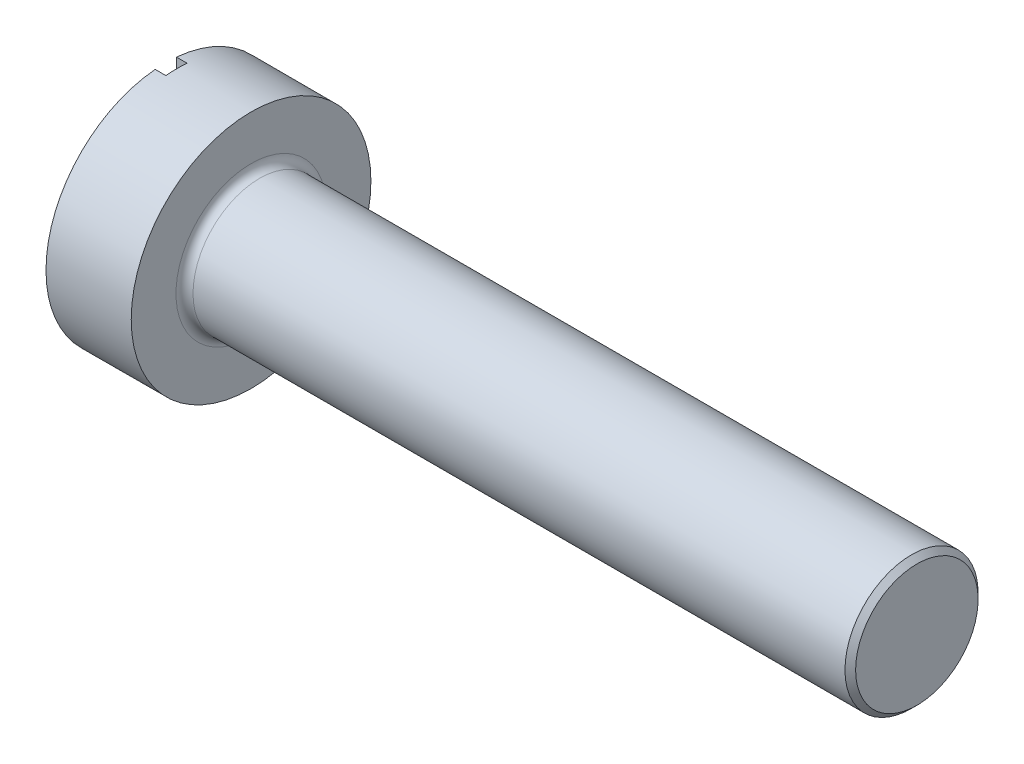
ISO-10303-21;
HEADER;
FILE_DESCRIPTION(('STEP AP214'),'2;1');
FILE_NAME('part.step','',(''),(''),'','','');
FILE_SCHEMA(('AUTOMOTIVE_DESIGN { 1 0 10303 214 1 1 1 1 }'));
ENDSEC;
DATA;
#1=APPLICATION_CONTEXT('core data for automotive mechanical design processes');
#2=APPLICATION_PROTOCOL_DEFINITION('international standard','automotive_design',2000,#1);
#3=PRODUCT_CONTEXT('',#1,'mechanical');
#4=PRODUCT('Part','Part','',(#3));
#5=PRODUCT_RELATED_PRODUCT_CATEGORY('part','',(#4));
#6=PRODUCT_DEFINITION_FORMATION('','',#4);
#7=PRODUCT_DEFINITION_CONTEXT('part definition',#1,'design');
#8=PRODUCT_DEFINITION('design','',#6,#7);
#9=PRODUCT_DEFINITION_SHAPE('','',#8);
#10=(LENGTH_UNIT() NAMED_UNIT(*) SI_UNIT(.MILLI.,.METRE.));
#11=(NAMED_UNIT(*) PLANE_ANGLE_UNIT() SI_UNIT($,.RADIAN.));
#12=(NAMED_UNIT(*) SI_UNIT($,.STERADIAN.) SOLID_ANGLE_UNIT());
#13=UNCERTAINTY_MEASURE_WITH_UNIT(LENGTH_MEASURE(1.E-05),#10,'distance_accuracy_value','');
#14=(GEOMETRIC_REPRESENTATION_CONTEXT(3) GLOBAL_UNCERTAINTY_ASSIGNED_CONTEXT((#13)) GLOBAL_UNIT_ASSIGNED_CONTEXT((#10,
#11,#12)) REPRESENTATION_CONTEXT('',''));
#15=CARTESIAN_POINT('',(0.,0.,0.));
#16=DIRECTION('',(0.,0.,1.));
#17=DIRECTION('',(1.,0.,0.));
#18=AXIS2_PLACEMENT_3D('',#15,#16,#17);
#19=CARTESIAN_POINT('',(0.,0.,0.));
#20=DIRECTION('',(-1.,0.,0.));
#21=DIRECTION('',(0.,0.,1.));
#22=AXIS2_PLACEMENT_3D('',#19,#20,#21);
#23=CYLINDRICAL_SURFACE('',#22,2.25);
#24=CARTESIAN_POINT('',(1.6,0.,0.));
#25=DIRECTION('',(-1.,0.,0.));
#26=DIRECTION('',(0.,0.,1.));
#27=AXIS2_PLACEMENT_3D('',#24,#25,#26);
#28=CIRCLE('',#27,2.25);
#29=CARTESIAN_POINT('',(1.6,0.,2.25));
#30=VERTEX_POINT('',#29);
#31=EDGE_CURVE('E92',#30,#30,#28,.T.);
#32=ORIENTED_EDGE('',*,*,#31,.T.);
#33=EDGE_LOOP('',(#32));
#34=FACE_BOUND('',#33,.T.);
#35=DIRECTION('',(-1.,0.,0.));
#36=VECTOR('',#35,1.);
#37=CARTESIAN_POINT('',(0.,-2.2410934831015,0.2));
#38=LINE('',#37,#36);
#39=CARTESIAN_POINT('',(0.2,-2.2410934831015,0.2));
#40=VERTEX_POINT('',#39);
#41=CARTESIAN_POINT('',(0.,-2.2410934831015,0.2));
#42=VERTEX_POINT('',#41);
#43=EDGE_CURVE('E122',#40,#42,#38,.T.);
#44=ORIENTED_EDGE('',*,*,#43,.F.);
#45=CARTESIAN_POINT('',(0.2,0.,0.));
#46=DIRECTION('',(-1.,0.,0.));
#47=DIRECTION('',(0.,0.,1.));
#48=AXIS2_PLACEMENT_3D('',#45,#46,#47);
#49=CIRCLE('',#48,2.25);
#50=CARTESIAN_POINT('',(0.2,-2.2410934831015,-0.2));
#51=VERTEX_POINT('',#50);
#52=EDGE_CURVE('E11',#40,#51,#49,.F.);
#53=ORIENTED_EDGE('',*,*,#52,.T.);
#54=DIRECTION('',(-1.,0.,0.));
#55=VECTOR('',#54,1.);
#56=CARTESIAN_POINT('',(0.,-2.2410934831015,-0.2));
#57=LINE('',#56,#55);
#58=CARTESIAN_POINT('',(0.,-2.2410934831015,-0.2));
#59=VERTEX_POINT('',#58);
#60=EDGE_CURVE('E79',#51,#59,#57,.T.);
#61=ORIENTED_EDGE('',*,*,#60,.T.);
#62=CARTESIAN_POINT('',(0.,0.,0.));
#63=DIRECTION('',(-1.,0.,0.));
#64=DIRECTION('',(0.,0.,1.));
#65=AXIS2_PLACEMENT_3D('',#62,#63,#64);
#66=CIRCLE('',#65,2.25);
#67=CARTESIAN_POINT('',(0.,2.2410934831015,-0.2));
#68=VERTEX_POINT('',#67);
#69=EDGE_CURVE('E88',#68,#59,#66,.T.);
#70=ORIENTED_EDGE('',*,*,#69,.F.);
#71=DIRECTION('',(-1.,0.,0.));
#72=VECTOR('',#71,1.);
#73=CARTESIAN_POINT('',(0.,2.2410934831015,-0.2));
#74=LINE('',#73,#72);
#75=CARTESIAN_POINT('',(0.2,2.2410934831015,-0.2));
#76=VERTEX_POINT('',#75);
#77=EDGE_CURVE('E52',#68,#76,#74,.F.);
#78=ORIENTED_EDGE('',*,*,#77,.T.);
#79=CARTESIAN_POINT('',(0.2,2.2410934831015,0.2));
#80=VERTEX_POINT('',#79);
#81=EDGE_CURVE('E41',#76,#80,#49,.F.);
#82=ORIENTED_EDGE('',*,*,#81,.T.);
#83=DIRECTION('',(-1.,0.,0.));
#84=VECTOR('',#83,1.);
#85=CARTESIAN_POINT('',(0.,2.2410934831015,0.2));
#86=LINE('',#85,#84);
#87=CARTESIAN_POINT('',(0.,2.2410934831015,0.2));
#88=VERTEX_POINT('',#87);
#89=EDGE_CURVE('E99',#88,#80,#86,.F.);
#90=ORIENTED_EDGE('',*,*,#89,.F.);
#91=EDGE_CURVE('E93',#42,#88,#66,.T.);
#92=ORIENTED_EDGE('',*,*,#91,.F.);
#93=EDGE_LOOP('',(#44,#53,#61,#70,#78,#82,#90,#92));
#94=FACE_BOUND('',#93,.T.);
#95=ADVANCED_FACE('F37',(#34,#94),#23,.T.);
#96=CARTESIAN_POINT('',(0.,0.,0.));
#97=DIRECTION('',(-1.,0.,0.));
#98=DIRECTION('',(0.,0.,1.));
#99=AXIS2_PLACEMENT_3D('',#96,#97,#98);
#100=PLANE('',#99);
#101=ORIENTED_EDGE('',*,*,#69,.T.);
#102=DIRECTION('',(0.,1.,0.));
#103=VECTOR('',#102,1.);
#104=CARTESIAN_POINT('',(0.,0.,-0.2));
#105=LINE('',#104,#103);
#106=EDGE_CURVE('E76',#59,#68,#105,.T.);
#107=ORIENTED_EDGE('',*,*,#106,.T.);
#108=EDGE_LOOP('',(#101,#107));
#109=FACE_BOUND('',#108,.T.);
#110=ADVANCED_FACE('F91',(#109),#100,.T.);
#111=CARTESIAN_POINT('',(14.1,0.,0.));
#112=DIRECTION('',(-1.,0.,0.));
#113=DIRECTION('',(0.,0.,1.));
#114=AXIS2_PLACEMENT_3D('',#111,#112,#113);
#115=PLANE('',#114);
#116=CARTESIAN_POINT('',(14.1,0.,0.));
#117=DIRECTION('',(-1.,0.,0.));
#118=DIRECTION('',(0.,0.,1.));
#119=AXIS2_PLACEMENT_3D('',#116,#117,#118);
#120=CIRCLE('',#119,1.15);
#121=CARTESIAN_POINT('',(14.1,0.,1.15));
#122=VERTEX_POINT('',#121);
#123=EDGE_CURVE('E105',#122,#122,#120,.F.);
#124=ORIENTED_EDGE('',*,*,#123,.T.);
#125=EDGE_LOOP('',(#124));
#126=FACE_BOUND('',#125,.T.);
#127=ADVANCED_FACE('F141',(#126),#115,.F.);
#128=CARTESIAN_POINT('',(0.,0.,0.));
#129=DIRECTION('',(-1.,0.,0.));
#130=DIRECTION('',(0.,0.,1.));
#131=AXIS2_PLACEMENT_3D('',#128,#129,#130);
#132=CYLINDRICAL_SURFACE('',#131,1.25);
#133=CARTESIAN_POINT('',(1.76,0.,0.));
#134=DIRECTION('',(1.,0.,0.));
#135=DIRECTION('',(0.,0.,-1.));
#136=AXIS2_PLACEMENT_3D('',#133,#134,#135);
#137=CIRCLE('',#136,1.25);
#138=CARTESIAN_POINT('',(1.76,0.,-1.25));
#139=VERTEX_POINT('',#138);
#140=EDGE_CURVE('E84',#139,#139,#137,.T.);
#141=ORIENTED_EDGE('',*,*,#140,.T.);
#142=EDGE_LOOP('',(#141));
#143=FACE_BOUND('',#142,.T.);
#144=CARTESIAN_POINT('',(14.,0.,0.));
#145=DIRECTION('',(-1.,0.,0.));
#146=DIRECTION('',(0.,0.,1.));
#147=AXIS2_PLACEMENT_3D('',#144,#145,#146);
#148=CIRCLE('',#147,1.25);
#149=CARTESIAN_POINT('',(14.,0.,1.25));
#150=VERTEX_POINT('',#149);
#151=EDGE_CURVE('E96',#150,#150,#148,.T.);
#152=ORIENTED_EDGE('',*,*,#151,.T.);
#153=EDGE_LOOP('',(#152));
#154=FACE_BOUND('',#153,.T.);
#155=ADVANCED_FACE('F135',(#143,#154),#132,.T.);
#156=CARTESIAN_POINT('',(1.6,0.,0.));
#157=DIRECTION('',(1.,0.,0.));
#158=DIRECTION('',(0.,0.,-1.));
#159=AXIS2_PLACEMENT_3D('',#156,#157,#158);
#160=PLANE('',#159);
#161=CARTESIAN_POINT('',(1.6,0.,0.));
#162=DIRECTION('',(1.,0.,0.));
#163=DIRECTION('',(0.,0.,-1.));
#164=AXIS2_PLACEMENT_3D('',#161,#162,#163);
#165=CIRCLE('',#164,1.41);
#166=CARTESIAN_POINT('',(1.6,0.,-1.41));
#167=VERTEX_POINT('',#166);
#168=EDGE_CURVE('E108',#167,#167,#165,.F.);
#169=ORIENTED_EDGE('',*,*,#168,.T.);
#170=EDGE_LOOP('',(#169));
#171=FACE_BOUND('',#170,.T.);
#172=ORIENTED_EDGE('',*,*,#31,.F.);
#173=EDGE_LOOP('',(#172));
#174=FACE_BOUND('',#173,.T.);
#175=ADVANCED_FACE('F128',(#171,#174),#160,.T.);
#176=DIRECTION('',(0.,1.,0.));
#177=VECTOR('',#176,1.);
#178=CARTESIAN_POINT('',(0.,0.,0.2));
#179=LINE('',#178,#177);
#180=EDGE_CURVE('E60',#42,#88,#179,.T.);
#181=ORIENTED_EDGE('',*,*,#180,.F.);
#182=ORIENTED_EDGE('',*,*,#91,.T.);
#183=EDGE_LOOP('',(#181,#182));
#184=FACE_BOUND('',#183,.T.);
#185=ADVANCED_FACE('F125',(#184),#100,.T.);
#186=CARTESIAN_POINT('',(14.,0.,0.));
#187=DIRECTION('',(-1.,0.,0.));
#188=DIRECTION('',(0.,0.,1.));
#189=AXIS2_PLACEMENT_3D('',#186,#187,#188);
#190=CONICAL_SURFACE('',#189,1.25,0.785398163397448);
#191=ORIENTED_EDGE('',*,*,#123,.F.);
#192=EDGE_LOOP('',(#191));
#193=FACE_BOUND('',#192,.T.);
#194=ORIENTED_EDGE('',*,*,#151,.F.);
#195=EDGE_LOOP('',(#194));
#196=FACE_BOUND('',#195,.T.);
#197=ADVANCED_FACE('F127',(#193,#196),#190,.T.);
#198=CARTESIAN_POINT('',(1.76,0.,0.));
#199=DIRECTION('',(1.,0.,0.));
#200=DIRECTION('',(0.,0.,-1.));
#201=AXIS2_PLACEMENT_3D('',#198,#199,#200);
#202=TOROIDAL_SURFACE('',#201,1.41,0.16);
#203=ORIENTED_EDGE('',*,*,#140,.F.);
#204=EDGE_LOOP('',(#203));
#205=FACE_BOUND('',#204,.T.);
#206=ORIENTED_EDGE('',*,*,#168,.F.);
#207=EDGE_LOOP('',(#206));
#208=FACE_BOUND('',#207,.T.);
#209=ADVANCED_FACE('F39',(#205,#208),#202,.F.);
#210=CARTESIAN_POINT('',(0.2,-2.25,0.));
#211=DIRECTION('',(-1.,0.,0.));
#212=DIRECTION('',(0.,0.,1.));
#213=AXIS2_PLACEMENT_3D('',#210,#211,#212);
#214=PLANE('',#213);
#215=DIRECTION('',(0.,1.,0.));
#216=VECTOR('',#215,1.);
#217=CARTESIAN_POINT('',(0.2,-2.25,0.2));
#218=LINE('',#217,#216);
#219=EDGE_CURVE('E89',#40,#80,#218,.T.);
#220=ORIENTED_EDGE('',*,*,#219,.T.);
#221=ORIENTED_EDGE('',*,*,#81,.F.);
#222=DIRECTION('',(0.,1.,0.));
#223=VECTOR('',#222,1.);
#224=CARTESIAN_POINT('',(0.2,-2.25,-0.2));
#225=LINE('',#224,#223);
#226=EDGE_CURVE('E117',#51,#76,#225,.T.);
#227=ORIENTED_EDGE('',*,*,#226,.F.);
#228=ORIENTED_EDGE('',*,*,#52,.F.);
#229=EDGE_LOOP('',(#220,#221,#227,#228));
#230=FACE_BOUND('',#229,.T.);
#231=ADVANCED_FACE('F116',(#230),#214,.T.);
#232=CARTESIAN_POINT('',(0.,-2.25,0.2));
#233=DIRECTION('',(0.,0.,1.));
#234=DIRECTION('',(1.,0.,0.));
#235=AXIS2_PLACEMENT_3D('',#232,#233,#234);
#236=PLANE('',#235);
#237=ORIENTED_EDGE('',*,*,#89,.T.);
#238=ORIENTED_EDGE('',*,*,#219,.F.);
#239=ORIENTED_EDGE('',*,*,#43,.T.);
#240=ORIENTED_EDGE('',*,*,#180,.T.);
#241=EDGE_LOOP('',(#237,#238,#239,#240));
#242=FACE_BOUND('',#241,.T.);
#243=ADVANCED_FACE('F123',(#242),#236,.F.);
#244=CARTESIAN_POINT('',(0.,-2.25,-0.2));
#245=DIRECTION('',(0.,0.,1.));
#246=DIRECTION('',(1.,0.,0.));
#247=AXIS2_PLACEMENT_3D('',#244,#245,#246);
#248=PLANE('',#247);
#249=ORIENTED_EDGE('',*,*,#106,.F.);
#250=ORIENTED_EDGE('',*,*,#60,.F.);
#251=ORIENTED_EDGE('',*,*,#226,.T.);
#252=ORIENTED_EDGE('',*,*,#77,.F.);
#253=EDGE_LOOP('',(#249,#250,#251,#252));
#254=FACE_BOUND('',#253,.T.);
#255=ADVANCED_FACE('F78',(#254),#248,.T.);
#256=CLOSED_SHELL('',(#95,#110,#127,#155,#175,#185,#197,#209,#231,#243,#255));
#257=MANIFOLD_SOLID_BREP('B2',#256);
#258=ADVANCED_BREP_SHAPE_REPRESENTATION('',(#18,#257),#14);
#259=SHAPE_DEFINITION_REPRESENTATION(#9,#258);
ENDSEC;
END-ISO-10303-21;
